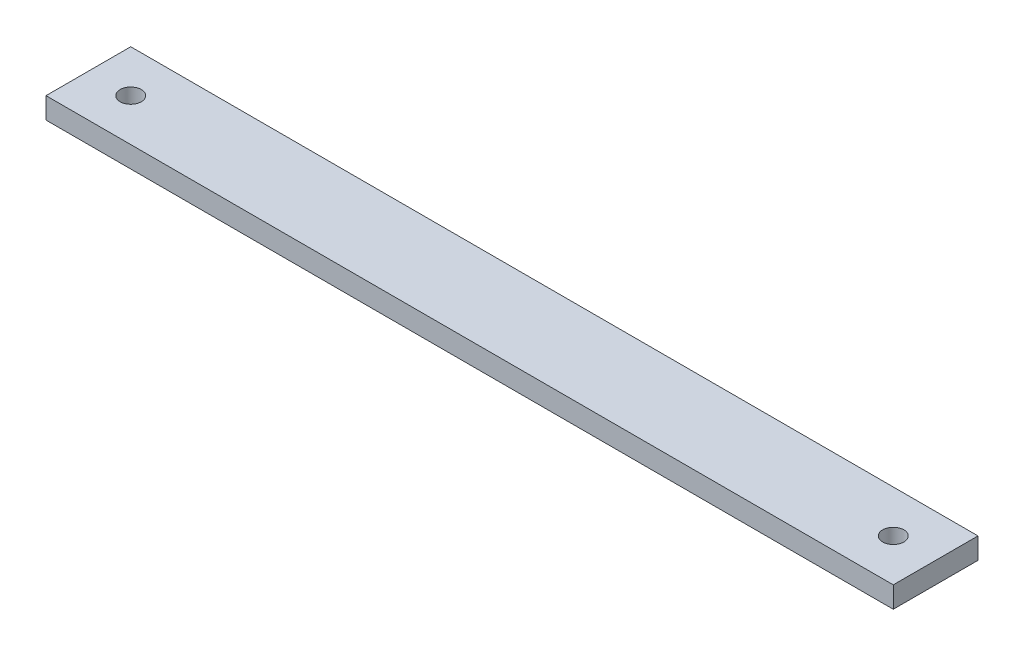
ISO-10303-21;
HEADER;
FILE_DESCRIPTION(('STEP AP214'),'2;1');
FILE_NAME('part.step','',(''),(''),'','','');
FILE_SCHEMA(('AUTOMOTIVE_DESIGN { 1 0 10303 214 1 1 1 1 }'));
ENDSEC;
DATA;
#1=APPLICATION_CONTEXT('core data for automotive mechanical design processes');
#2=APPLICATION_PROTOCOL_DEFINITION('international standard','automotive_design',2000,#1);
#3=PRODUCT_CONTEXT('',#1,'mechanical');
#4=PRODUCT('Part','Part','',(#3));
#5=PRODUCT_RELATED_PRODUCT_CATEGORY('part','',(#4));
#6=PRODUCT_DEFINITION_FORMATION('','',#4);
#7=PRODUCT_DEFINITION_CONTEXT('part definition',#1,'design');
#8=PRODUCT_DEFINITION('design','',#6,#7);
#9=PRODUCT_DEFINITION_SHAPE('','',#8);
#10=(LENGTH_UNIT() NAMED_UNIT(*) SI_UNIT(.MILLI.,.METRE.));
#11=(NAMED_UNIT(*) PLANE_ANGLE_UNIT() SI_UNIT($,.RADIAN.));
#12=(NAMED_UNIT(*) SI_UNIT($,.STERADIAN.) SOLID_ANGLE_UNIT());
#13=UNCERTAINTY_MEASURE_WITH_UNIT(LENGTH_MEASURE(1.E-05),#10,'distance_accuracy_value','');
#14=(GEOMETRIC_REPRESENTATION_CONTEXT(3) GLOBAL_UNCERTAINTY_ASSIGNED_CONTEXT((#13)) GLOBAL_UNIT_ASSIGNED_CONTEXT((#10,
#11,#12)) REPRESENTATION_CONTEXT('',''));
#15=CARTESIAN_POINT('',(0.,0.,0.));
#16=DIRECTION('',(0.,0.,1.));
#17=DIRECTION('',(1.,0.,0.));
#18=AXIS2_PLACEMENT_3D('',#15,#16,#17);
#19=CARTESIAN_POINT('',(0.,6.35,0.));
#20=DIRECTION('',(-1.,0.,0.));
#21=DIRECTION('',(0.,0.,1.));
#22=AXIS2_PLACEMENT_3D('',#19,#20,#21);
#23=PLANE('',#22);
#24=DIRECTION('',(0.,0.,-1.));
#25=VECTOR('',#24,1.);
#26=CARTESIAN_POINT('',(0.,0.,0.));
#27=LINE('',#26,#25);
#28=CARTESIAN_POINT('',(0.,0.,0.));
#29=VERTEX_POINT('',#28);
#30=CARTESIAN_POINT('',(0.,0.,-25.4));
#31=VERTEX_POINT('',#30);
#32=EDGE_CURVE('E99',#29,#31,#27,.T.);
#33=ORIENTED_EDGE('',*,*,#32,.T.);
#34=DIRECTION('',(0.,-1.,0.));
#35=VECTOR('',#34,1.);
#36=CARTESIAN_POINT('',(0.,6.35,-25.4));
#37=LINE('',#36,#35);
#38=CARTESIAN_POINT('',(0.,6.35,-25.4));
#39=VERTEX_POINT('',#38);
#40=EDGE_CURVE('E11',#39,#31,#37,.T.);
#41=ORIENTED_EDGE('',*,*,#40,.F.);
#42=DIRECTION('',(0.,0.,-1.));
#43=VECTOR('',#42,1.);
#44=CARTESIAN_POINT('',(0.,6.35,0.));
#45=LINE('',#44,#43);
#46=CARTESIAN_POINT('',(0.,6.35,0.));
#47=VERTEX_POINT('',#46);
#48=EDGE_CURVE('E87',#47,#39,#45,.T.);
#49=ORIENTED_EDGE('',*,*,#48,.F.);
#50=DIRECTION('',(0.,-1.,0.));
#51=VECTOR('',#50,1.);
#52=CARTESIAN_POINT('',(0.,6.35,0.));
#53=LINE('',#52,#51);
#54=EDGE_CURVE('E95',#47,#29,#53,.T.);
#55=ORIENTED_EDGE('',*,*,#54,.T.);
#56=EDGE_LOOP('',(#33,#41,#49,#55));
#57=FACE_BOUND('',#56,.T.);
#58=ADVANCED_FACE('F35',(#57),#23,.F.);
#59=CARTESIAN_POINT('',(0.,6.35,-25.4));
#60=DIRECTION('',(0.,0.,1.));
#61=DIRECTION('',(1.,0.,0.));
#62=AXIS2_PLACEMENT_3D('',#59,#60,#61);
#63=PLANE('',#62);
#64=DIRECTION('',(-1.,0.,0.));
#65=VECTOR('',#64,1.);
#66=CARTESIAN_POINT('',(0.,0.,-25.4));
#67=LINE('',#66,#65);
#68=CARTESIAN_POINT('',(-254.,0.,-25.4));
#69=VERTEX_POINT('',#68);
#70=EDGE_CURVE('E91',#31,#69,#67,.T.);
#71=ORIENTED_EDGE('',*,*,#70,.T.);
#72=DIRECTION('',(0.,-1.,0.));
#73=VECTOR('',#72,1.);
#74=CARTESIAN_POINT('',(-254.,6.35,-25.4));
#75=LINE('',#74,#73);
#76=CARTESIAN_POINT('',(-254.,6.35,-25.4));
#77=VERTEX_POINT('',#76);
#78=EDGE_CURVE('E44',#77,#69,#75,.T.);
#79=ORIENTED_EDGE('',*,*,#78,.F.);
#80=DIRECTION('',(-1.,0.,0.));
#81=VECTOR('',#80,1.);
#82=CARTESIAN_POINT('',(0.,6.35,-25.4));
#83=LINE('',#82,#81);
#84=EDGE_CURVE('E82',#39,#77,#83,.T.);
#85=ORIENTED_EDGE('',*,*,#84,.F.);
#86=ORIENTED_EDGE('',*,*,#40,.T.);
#87=EDGE_LOOP('',(#71,#79,#85,#86));
#88=FACE_BOUND('',#87,.T.);
#89=ADVANCED_FACE('F90',(#88),#63,.F.);
#90=CARTESIAN_POINT('',(-254.,6.35,0.));
#91=DIRECTION('',(1.,0.,0.));
#92=DIRECTION('',(0.,0.,-1.));
#93=AXIS2_PLACEMENT_3D('',#90,#91,#92);
#94=PLANE('',#93);
#95=DIRECTION('',(0.,0.,1.));
#96=VECTOR('',#95,1.);
#97=CARTESIAN_POINT('',(-254.,0.,0.));
#98=LINE('',#97,#96);
#99=CARTESIAN_POINT('',(-254.,0.,0.));
#100=VERTEX_POINT('',#99);
#101=EDGE_CURVE('E69',#69,#100,#98,.T.);
#102=ORIENTED_EDGE('',*,*,#101,.T.);
#103=DIRECTION('',(0.,-1.,0.));
#104=VECTOR('',#103,1.);
#105=CARTESIAN_POINT('',(-254.,6.35,0.));
#106=LINE('',#105,#104);
#107=CARTESIAN_POINT('',(-254.,6.35,0.));
#108=VERTEX_POINT('',#107);
#109=EDGE_CURVE('E92',#108,#100,#106,.T.);
#110=ORIENTED_EDGE('',*,*,#109,.F.);
#111=DIRECTION('',(0.,0.,1.));
#112=VECTOR('',#111,1.);
#113=CARTESIAN_POINT('',(-254.,6.35,0.));
#114=LINE('',#113,#112);
#115=EDGE_CURVE('E85',#77,#108,#114,.T.);
#116=ORIENTED_EDGE('',*,*,#115,.F.);
#117=ORIENTED_EDGE('',*,*,#78,.T.);
#118=EDGE_LOOP('',(#102,#110,#116,#117));
#119=FACE_BOUND('',#118,.T.);
#120=ADVANCED_FACE('F93',(#119),#94,.F.);
#121=CARTESIAN_POINT('',(0.,6.35,0.));
#122=DIRECTION('',(0.,0.,-1.));
#123=DIRECTION('',(-1.,0.,0.));
#124=AXIS2_PLACEMENT_3D('',#121,#122,#123);
#125=PLANE('',#124);
#126=DIRECTION('',(1.,0.,0.));
#127=VECTOR('',#126,1.);
#128=CARTESIAN_POINT('',(0.,0.,0.));
#129=LINE('',#128,#127);
#130=EDGE_CURVE('E75',#100,#29,#129,.T.);
#131=ORIENTED_EDGE('',*,*,#130,.T.);
#132=ORIENTED_EDGE('',*,*,#54,.F.);
#133=DIRECTION('',(1.,0.,0.));
#134=VECTOR('',#133,1.);
#135=CARTESIAN_POINT('',(0.,6.35,0.));
#136=LINE('',#135,#134);
#137=EDGE_CURVE('E52',#108,#47,#136,.T.);
#138=ORIENTED_EDGE('',*,*,#137,.F.);
#139=ORIENTED_EDGE('',*,*,#109,.T.);
#140=EDGE_LOOP('',(#131,#132,#138,#139));
#141=FACE_BOUND('',#140,.T.);
#142=ADVANCED_FACE('F114',(#141),#125,.F.);
#143=CARTESIAN_POINT('',(0.,6.35,0.));
#144=DIRECTION('',(0.,1.,0.));
#145=DIRECTION('',(0.,0.,1.));
#146=AXIS2_PLACEMENT_3D('',#143,#144,#145);
#147=PLANE('',#146);
#148=CARTESIAN_POINT('',(-241.3,6.35,-12.7));
#149=DIRECTION('',(0.,-1.,0.));
#150=DIRECTION('',(0.,0.,-1.));
#151=AXIS2_PLACEMENT_3D('',#148,#149,#150);
#152=CIRCLE('',#151,3.17500000000001);
#153=CARTESIAN_POINT('',(-241.3,6.35,-15.875));
#154=VERTEX_POINT('',#153);
#155=EDGE_CURVE('E125',#154,#154,#152,.T.);
#156=ORIENTED_EDGE('',*,*,#155,.T.);
#157=EDGE_LOOP('',(#156));
#158=FACE_BOUND('',#157,.T.);
#159=CARTESIAN_POINT('',(-12.7,6.35,-12.7));
#160=DIRECTION('',(0.,-1.,0.));
#161=DIRECTION('',(0.,0.,-1.));
#162=AXIS2_PLACEMENT_3D('',#159,#160,#161);
#163=CIRCLE('',#162,3.175);
#164=CARTESIAN_POINT('',(-12.7,6.35,-15.875));
#165=VERTEX_POINT('',#164);
#166=EDGE_CURVE('E103',#165,#165,#163,.T.);
#167=ORIENTED_EDGE('',*,*,#166,.T.);
#168=EDGE_LOOP('',(#167));
#169=FACE_BOUND('',#168,.T.);
#170=ORIENTED_EDGE('',*,*,#48,.T.);
#171=ORIENTED_EDGE('',*,*,#84,.T.);
#172=ORIENTED_EDGE('',*,*,#115,.T.);
#173=ORIENTED_EDGE('',*,*,#137,.T.);
#174=EDGE_LOOP('',(#170,#171,#172,#173));
#175=FACE_BOUND('',#174,.T.);
#176=ADVANCED_FACE('F83',(#158,#169,#175),#147,.T.);
#177=CARTESIAN_POINT('',(0.,0.,0.));
#178=DIRECTION('',(0.,1.,0.));
#179=DIRECTION('',(0.,0.,1.));
#180=AXIS2_PLACEMENT_3D('',#177,#178,#179);
#181=PLANE('',#180);
#182=CARTESIAN_POINT('',(-241.3,0.,-12.7));
#183=DIRECTION('',(0.,-1.,0.));
#184=DIRECTION('',(0.,0.,-1.));
#185=AXIS2_PLACEMENT_3D('',#182,#183,#184);
#186=CIRCLE('',#185,3.17499999999998);
#187=CARTESIAN_POINT('',(-241.3,0.,-15.875));
#188=VERTEX_POINT('',#187);
#189=EDGE_CURVE('E128',#188,#188,#186,.T.);
#190=ORIENTED_EDGE('',*,*,#189,.F.);
#191=EDGE_LOOP('',(#190));
#192=FACE_BOUND('',#191,.T.);
#193=CARTESIAN_POINT('',(-12.7,0.,-12.7));
#194=DIRECTION('',(0.,-1.,0.));
#195=DIRECTION('',(0.,0.,-1.));
#196=AXIS2_PLACEMENT_3D('',#193,#194,#195);
#197=CIRCLE('',#196,3.17499999999999);
#198=CARTESIAN_POINT('',(-12.7,0.,-15.875));
#199=VERTEX_POINT('',#198);
#200=EDGE_CURVE('E122',#199,#199,#197,.T.);
#201=ORIENTED_EDGE('',*,*,#200,.F.);
#202=EDGE_LOOP('',(#201));
#203=FACE_BOUND('',#202,.T.);
#204=ORIENTED_EDGE('',*,*,#32,.F.);
#205=ORIENTED_EDGE('',*,*,#130,.F.);
#206=ORIENTED_EDGE('',*,*,#101,.F.);
#207=ORIENTED_EDGE('',*,*,#70,.F.);
#208=EDGE_LOOP('',(#204,#205,#206,#207));
#209=FACE_BOUND('',#208,.T.);
#210=ADVANCED_FACE('F117',(#192,#203,#209),#181,.F.);
#211=CARTESIAN_POINT('',(-12.7,0.,-12.7));
#212=DIRECTION('',(0.,-1.,0.));
#213=DIRECTION('',(0.,0.,-1.));
#214=AXIS2_PLACEMENT_3D('',#211,#212,#213);
#215=CYLINDRICAL_SURFACE('',#214,3.17499999999999);
#216=ORIENTED_EDGE('',*,*,#166,.F.);
#217=EDGE_LOOP('',(#216));
#218=FACE_BOUND('',#217,.T.);
#219=ORIENTED_EDGE('',*,*,#200,.T.);
#220=EDGE_LOOP('',(#219));
#221=FACE_BOUND('',#220,.T.);
#222=ADVANCED_FACE('F136',(#218,#221),#215,.F.);
#223=CARTESIAN_POINT('',(-241.3,0.,-12.7));
#224=DIRECTION('',(0.,-1.,0.));
#225=DIRECTION('',(0.,0.,-1.));
#226=AXIS2_PLACEMENT_3D('',#223,#224,#225);
#227=CYLINDRICAL_SURFACE('',#226,3.175);
#228=ORIENTED_EDGE('',*,*,#155,.F.);
#229=EDGE_LOOP('',(#228));
#230=FACE_BOUND('',#229,.T.);
#231=ORIENTED_EDGE('',*,*,#189,.T.);
#232=EDGE_LOOP('',(#231));
#233=FACE_BOUND('',#232,.T.);
#234=ADVANCED_FACE('F132',(#230,#233),#227,.F.);
#235=CLOSED_SHELL('',(#58,#89,#120,#142,#176,#210,#222,#234));
#236=MANIFOLD_SOLID_BREP('B2',#235);
#237=ADVANCED_BREP_SHAPE_REPRESENTATION('',(#18,#236),#14);
#238=SHAPE_DEFINITION_REPRESENTATION(#9,#237);
ENDSEC;
END-ISO-10303-21;
